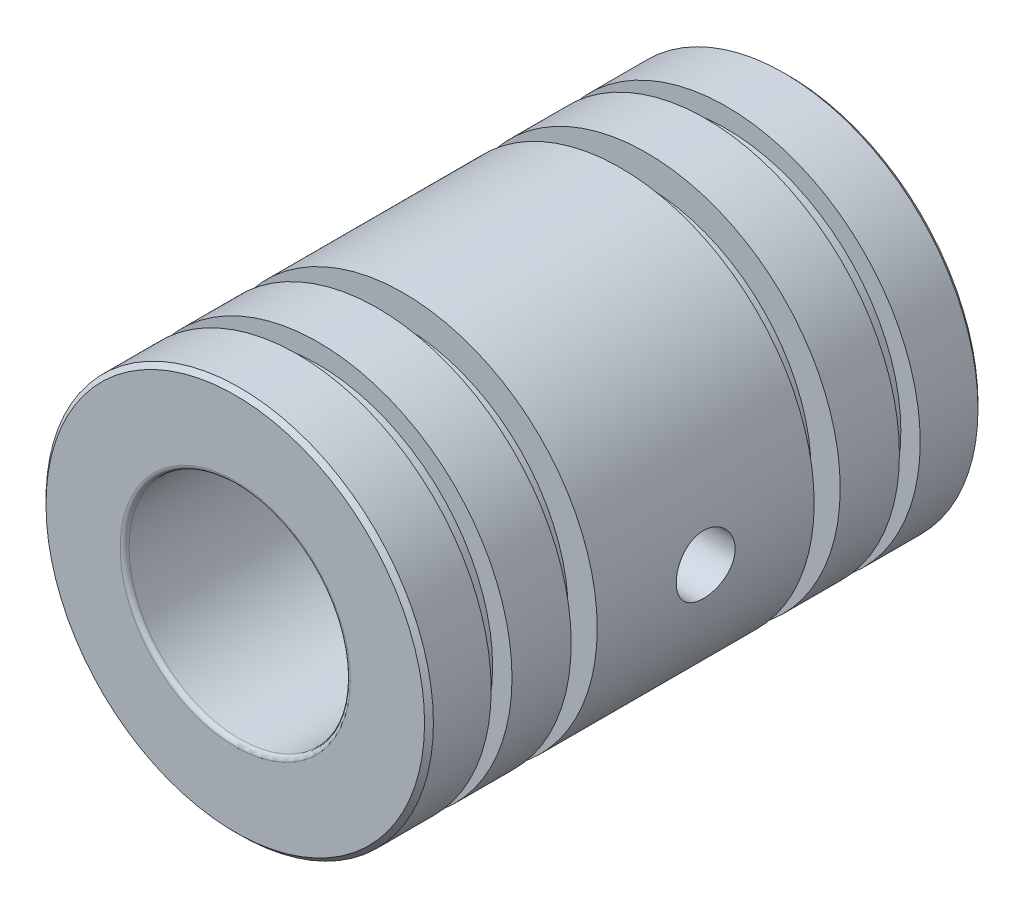
ISO-10303-21;
HEADER;
FILE_DESCRIPTION(('STEP AP214'),'2;1');
FILE_NAME('part.step','',(''),(''),'','','');
FILE_SCHEMA(('AUTOMOTIVE_DESIGN { 1 0 10303 214 1 1 1 1 }'));
ENDSEC;
DATA;
#1=APPLICATION_CONTEXT('core data for automotive mechanical design processes');
#2=APPLICATION_PROTOCOL_DEFINITION('international standard','automotive_design',2000,#1);
#3=PRODUCT_CONTEXT('',#1,'mechanical');
#4=PRODUCT('Part','Part','',(#3));
#5=PRODUCT_RELATED_PRODUCT_CATEGORY('part','',(#4));
#6=PRODUCT_DEFINITION_FORMATION('','',#4);
#7=PRODUCT_DEFINITION_CONTEXT('part definition',#1,'design');
#8=PRODUCT_DEFINITION('design','',#6,#7);
#9=PRODUCT_DEFINITION_SHAPE('','',#8);
#10=(LENGTH_UNIT() NAMED_UNIT(*) SI_UNIT(.MILLI.,.METRE.));
#11=(NAMED_UNIT(*) PLANE_ANGLE_UNIT() SI_UNIT($,.RADIAN.));
#12=(NAMED_UNIT(*) SI_UNIT($,.STERADIAN.) SOLID_ANGLE_UNIT());
#13=UNCERTAINTY_MEASURE_WITH_UNIT(LENGTH_MEASURE(1.E-05),#10,'distance_accuracy_value','');
#14=(GEOMETRIC_REPRESENTATION_CONTEXT(3) GLOBAL_UNCERTAINTY_ASSIGNED_CONTEXT((#13)) GLOBAL_UNIT_ASSIGNED_CONTEXT((#10,
#11,#12)) REPRESENTATION_CONTEXT('',''));
#15=CARTESIAN_POINT('',(0.,0.,0.));
#16=DIRECTION('',(0.,0.,1.));
#17=DIRECTION('',(1.,0.,0.));
#18=AXIS2_PLACEMENT_3D('',#15,#16,#17);
#19=CARTESIAN_POINT('',(0.,0.,15.875));
#20=DIRECTION('',(0.,0.,1.));
#21=DIRECTION('',(1.,0.,0.));
#22=AXIS2_PLACEMENT_3D('',#19,#20,#21);
#23=CYLINDRICAL_SURFACE('',#22,11.1125);
#24=CARTESIAN_POINT('',(0.,0.,-6.223));
#25=DIRECTION('',(0.,0.,1.));
#26=DIRECTION('',(1.,0.,0.));
#27=AXIS2_PLACEMENT_3D('',#24,#25,#26);
#28=CIRCLE('',#27,11.1125);
#29=CARTESIAN_POINT('',(11.1125,0.,-6.223));
#30=VERTEX_POINT('',#29);
#31=EDGE_CURVE('E172',#30,#30,#28,.T.);
#32=ORIENTED_EDGE('',*,*,#31,.T.);
#33=EDGE_LOOP('',(#32));
#34=FACE_BOUND('',#33,.T.);
#35=CARTESIAN_POINT('',(11.1125,0.,1.6891));
#36=CARTESIAN_POINT('',(11.1124984749764,0.0942947180013888,1.68909612294214));
#37=CARTESIAN_POINT('',(11.1112872289959,0.188643778422902,1.68117727792472));
#38=CARTESIAN_POINT('',(11.1065719094548,0.374703670779465,1.64971973587848));
#39=CARTESIAN_POINT('',(11.1030656176681,0.466411860620228,1.62616592690704));
#40=CARTESIAN_POINT('',(11.0941541485188,0.644470515147497,1.56415938509329));
#41=CARTESIAN_POINT('',(11.0887504202695,0.730825009517612,1.52571801990011));
#42=CARTESIAN_POINT('',(11.0766408487434,0.895844867603549,1.43505558685331));
#43=CARTESIAN_POINT('',(11.0699351826595,0.974511275474935,1.38283639380604));
#44=CARTESIAN_POINT('',(11.0559070755672,1.12256520688657,1.26565485848024));
#45=CARTESIAN_POINT('',(11.0485805591148,1.19188219867193,1.20060388076072));
#46=CARTESIAN_POINT('',(11.0341683126251,1.31866102464177,1.05979607587218));
#47=CARTESIAN_POINT('',(11.0270825966066,1.37612216959946,0.984038626725219));
#48=CARTESIAN_POINT('',(11.0139146832658,1.47783369468768,0.823493222296239));
#49=CARTESIAN_POINT('',(11.0078377528534,1.52201565855481,0.738661453255868));
#50=CARTESIAN_POINT('',(10.9974312075013,1.59547740381971,0.562673340789719));
#51=CARTESIAN_POINT('',(10.993101494747,1.62475801946609,0.471517351748714));
#52=CARTESIAN_POINT('',(10.986719733247,1.66736648294441,0.286210857830755));
#53=CARTESIAN_POINT('',(10.9846504358495,1.68081520210582,0.1920887504306));
#54=CARTESIAN_POINT('',(10.9829714532546,1.69175259706892,0.00290273679306399));
#55=CARTESIAN_POINT('',(10.9833616230911,1.68924221353165,-0.0921611136063572));
#56=CARTESIAN_POINT('',(10.98654172094,1.66843140473334,-0.279677221021018));
#57=CARTESIAN_POINT('',(10.9893111685702,1.65026573312238,-0.372144830610382));
#58=CARTESIAN_POINT('',(10.9969057739665,1.59887100914534,-0.552704167925289));
#59=CARTESIAN_POINT('',(11.0017309913134,1.56564152019467,-0.640795768741774));
#60=CARTESIAN_POINT('',(11.0129160199178,1.48492267839586,-0.810511730441491));
#61=CARTESIAN_POINT('',(11.0192819395245,1.43737637644152,-0.892108586616015));
#62=CARTESIAN_POINT('',(11.0328266982025,1.32941411704717,-1.04621687762105));
#63=CARTESIAN_POINT('',(11.0400055920221,1.26899729262311,-1.11872769987534));
#64=CARTESIAN_POINT('',(11.0544578494198,1.1362699453425,-1.25338647800789));
#65=CARTESIAN_POINT('',(11.0617314257575,1.06384359306262,-1.3154202998185));
#66=CARTESIAN_POINT('',(11.0754850309764,0.909547536696382,-1.42647004973782));
#67=CARTESIAN_POINT('',(11.0819650562117,0.827677789226627,-1.47548591803803));
#68=CARTESIAN_POINT('',(11.0934084709383,0.656719032111041,-1.55911476726288));
#69=CARTESIAN_POINT('',(11.0983709172205,0.567625576107807,-1.59371879572403));
#70=CARTESIAN_POINT('',(11.1062121923282,0.384799714158148,-1.64744169192));
#71=CARTESIAN_POINT('',(11.1090911658332,0.291067630808221,-1.66656163490471));
#72=CARTESIAN_POINT('',(11.112421917308,0.102610130028601,-1.6886215086741));
#73=CARTESIAN_POINT('',(11.112897228859,0.00790347744211958,-1.69171832437733));
#74=CARTESIAN_POINT('',(11.1114312077064,-0.180676576341288,-1.68206066902567));
#75=CARTESIAN_POINT('',(11.1094899518851,-0.274550003951263,-1.66930670225754));
#76=CARTESIAN_POINT('',(11.1034234746128,-0.458322602323618,-1.6284399818359));
#77=CARTESIAN_POINT('',(11.0993091450531,-0.548239192070575,-1.60040380351264));
#78=CARTESIAN_POINT('',(11.0893563085869,-0.722095562567064,-1.52984935737822));
#79=CARTESIAN_POINT('',(11.0835177188378,-0.806035055904753,-1.48733039372245));
#80=CARTESIAN_POINT('',(11.0707065865661,-0.966243395573769,-1.38865027731608));
#81=CARTESIAN_POINT('',(11.0637259145496,-1.04245038899353,-1.33238978055868));
#82=CARTESIAN_POINT('',(11.0494325133765,-1.18439701178817,-1.20796174900408));
#83=CARTESIAN_POINT('',(11.0421197643941,-1.25013601514223,-1.13979350259446));
#84=CARTESIAN_POINT('',(11.027911609323,-1.3698526481885,-0.992785986745421));
#85=CARTESIAN_POINT('',(11.0210203018191,-1.42372501407067,-0.913860538298523));
#86=CARTESIAN_POINT('',(11.0085083326755,-1.51744705688315,-0.747988458778747));
#87=CARTESIAN_POINT('',(11.0028876359869,-1.55729712062619,-0.661042049051912));
#88=CARTESIAN_POINT('',(10.9935830785829,-1.62168086975073,-0.48190777505487));
#89=CARTESIAN_POINT('',(10.9898922642499,-1.64626960444178,-0.389740073552651));
#90=CARTESIAN_POINT('',(10.9848469871641,-1.67960770135315,-0.202522863830925));
#91=CARTESIAN_POINT('',(10.9834923583473,-1.68835818941118,-0.107473560934064));
#92=CARTESIAN_POINT('',(10.9832791398472,-1.68974408363072,0.0817593406678498));
#93=CARTESIAN_POINT('',(10.9843949114726,-1.68254501939657,0.175941739865271));
#94=CARTESIAN_POINT('',(10.9889409995611,-1.65259125336064,0.361739654774807));
#95=CARTESIAN_POINT('',(10.9923713119127,-1.62983657919189,0.453355175046429));
#96=CARTESIAN_POINT('',(11.0011509180981,-1.5694766174462,0.631370741498581));
#97=CARTESIAN_POINT('',(11.0064986765956,-1.53188320910921,0.717774896039901));
#98=CARTESIAN_POINT('',(11.0185124399751,-1.44292944490171,0.883076412987434));
#99=CARTESIAN_POINT('',(11.0251784919029,-1.3915685976905,0.961973507340946));
#100=CARTESIAN_POINT('',(11.0391600468561,-1.2759377262068,1.1108617759138));
#101=CARTESIAN_POINT('',(11.0464813147751,-1.21154519534934,1.18075727796835));
#102=CARTESIAN_POINT('',(11.0609005014592,-1.07193772039806,1.30880915286964));
#103=CARTESIAN_POINT('',(11.0679983679652,-0.996720266689906,1.36696279598917));
#104=CARTESIAN_POINT('',(11.0812169924103,-0.837096535060927,1.47017510921196));
#105=CARTESIAN_POINT('',(11.0873319923142,-0.752640656325596,1.51515779596735));
#106=CARTESIAN_POINT('',(11.0978394926998,-0.577318458635133,1.59023171611085));
#107=CARTESIAN_POINT('',(11.1022337683781,-0.48645886095237,1.62033830496764));
#108=CARTESIAN_POINT('',(11.1078066875595,-0.329331519619616,1.65800913628462));
#109=CARTESIAN_POINT('',(11.1095575986727,-0.26403154459362,1.66965029472057));
#110=CARTESIAN_POINT('',(11.1119047832509,-0.132496649737016,1.68519703878132));
#111=CARTESIAN_POINT('',(11.1125010716477,-0.0662617420083522,1.68910272444325));
#112=CARTESIAN_POINT('',(11.1125,0.,1.6891));
#113=B_SPLINE_CURVE_WITH_KNOTS('',3,(#35,#36,#37,#38,#39,#40,#41,#42,#43,#44,#45,#46,#47,#48,
#49,#50,#51,#52,#53,#54,#55,#56,#57,#58,#59,#60,#61,#62,#63,#64,#65,#66,#67,#68,#69,#70,#71,#72,
#73,#74,#75,#76,#77,#78,#79,#80,#81,#82,#83,#84,#85,#86,#87,#88,#89,#90,#91,#92,#93,#94,#95,#96,
#97,#98,#99,#100,#101,#102,#103,#104,#105,#106,#107,#108,#109,#110,#111,#112),.UNSPECIFIED.,.T.,
.F.,(4,2,2,2,2,2,2,2,2,2,2,2,2,2,2,2,2,2,2,2,2,2,2,2,2,2,2,2,2,2,2,2,2,2,2,2,2,2,4),(0.,
0.28264201751582,0.565557620659231,0.848257623306881,1.1309191776106,1.41560627448944,
1.70030991668317,1.98645619418444,2.2725864500884,2.55651772854463,2.84043227168535,
3.12192714088812,3.40343016899077,3.68606808748625,3.96872505105919,4.25428632066245,
4.53984890219968,4.82558860818705,5.1113084700618,5.39422543767032,5.6771334046109,
5.95863665032551,6.24015342314451,6.52376900228936,6.80740153622974,7.09345689140637,
7.37950435497386,7.66451392392823,7.94950323261455,8.23154869897909,8.51359366431867,
8.79541329328923,9.07724298134879,9.36185661298471,9.64653633511838,9.93282740272132,
10.2188223331646,10.4174399763038,10.616055050852),.UNSPECIFIED.);
#114=CARTESIAN_POINT('',(11.1125,0.,1.6891));
#115=VERTEX_POINT('',#114);
#116=EDGE_CURVE('E93',#115,#115,#113,.T.);
#117=ORIENTED_EDGE('',*,*,#116,.T.);
#118=EDGE_LOOP('',(#117));
#119=FACE_BOUND('',#118,.T.);
#120=CARTESIAN_POINT('',(0.,0.,6.223));
#121=DIRECTION('',(0.,0.,1.));
#122=DIRECTION('',(1.,0.,0.));
#123=AXIS2_PLACEMENT_3D('',#120,#121,#122);
#124=CIRCLE('',#123,11.1125);
#125=CARTESIAN_POINT('',(11.1125,0.,6.223));
#126=VERTEX_POINT('',#125);
#127=EDGE_CURVE('E177',#126,#126,#124,.T.);
#128=ORIENTED_EDGE('',*,*,#127,.F.);
#129=EDGE_LOOP('',(#128));
#130=FACE_BOUND('',#129,.T.);
#131=ADVANCED_FACE('F41',(#34,#119,#130),#23,.T.);
#132=CARTESIAN_POINT('',(0.,0.,7.71525));
#133=DIRECTION('',(0.,0.,1.));
#134=DIRECTION('',(1.,0.,0.));
#135=AXIS2_PLACEMENT_3D('',#132,#133,#134);
#136=CIRCLE('',#135,11.1125);
#137=CARTESIAN_POINT('',(11.1125,0.,7.71525));
#138=VERTEX_POINT('',#137);
#139=EDGE_CURVE('E181',#138,#138,#136,.T.);
#140=ORIENTED_EDGE('',*,*,#139,.T.);
#141=EDGE_LOOP('',(#140));
#142=FACE_BOUND('',#141,.T.);
#143=CARTESIAN_POINT('',(0.,0.,11.1125));
#144=DIRECTION('',(0.,0.,1.));
#145=DIRECTION('',(1.,0.,0.));
#146=AXIS2_PLACEMENT_3D('',#143,#144,#145);
#147=CIRCLE('',#146,11.1125);
#148=CARTESIAN_POINT('',(11.1125,0.,11.1125));
#149=VERTEX_POINT('',#148);
#150=EDGE_CURVE('E217',#149,#149,#147,.T.);
#151=ORIENTED_EDGE('',*,*,#150,.F.);
#152=EDGE_LOOP('',(#151));
#153=FACE_BOUND('',#152,.T.);
#154=ADVANCED_FACE('F126',(#142,#153),#23,.T.);
#155=CARTESIAN_POINT('',(0.,0.,-7.71525));
#156=DIRECTION('',(0.,0.,1.));
#157=DIRECTION('',(1.,0.,0.));
#158=AXIS2_PLACEMENT_3D('',#155,#156,#157);
#159=CIRCLE('',#158,11.1125);
#160=CARTESIAN_POINT('',(11.1125,0.,-7.71525));
#161=VERTEX_POINT('',#160);
#162=EDGE_CURVE('E198',#161,#161,#159,.T.);
#163=ORIENTED_EDGE('',*,*,#162,.F.);
#164=EDGE_LOOP('',(#163));
#165=FACE_BOUND('',#164,.T.);
#166=CARTESIAN_POINT('',(0.,0.,-11.1125));
#167=DIRECTION('',(0.,0.,1.));
#168=DIRECTION('',(1.,0.,0.));
#169=AXIS2_PLACEMENT_3D('',#166,#167,#168);
#170=CIRCLE('',#169,11.1125);
#171=CARTESIAN_POINT('',(11.1125,0.,-11.1125));
#172=VERTEX_POINT('',#171);
#173=EDGE_CURVE('E214',#172,#172,#170,.T.);
#174=ORIENTED_EDGE('',*,*,#173,.T.);
#175=EDGE_LOOP('',(#174));
#176=FACE_BOUND('',#175,.T.);
#177=ADVANCED_FACE('F121',(#165,#176),#23,.T.);
#178=CARTESIAN_POINT('',(0.,0.,-15.875));
#179=DIRECTION('',(0.,0.,1.));
#180=DIRECTION('',(1.,0.,0.));
#181=AXIS2_PLACEMENT_3D('',#178,#179,#180);
#182=CYLINDRICAL_SURFACE('',#181,6.35);
#183=CARTESIAN_POINT('',(0.,0.,-15.621));
#184=DIRECTION('',(0.,0.,-1.));
#185=DIRECTION('',(-1.,0.,0.));
#186=AXIS2_PLACEMENT_3D('',#183,#184,#185);
#187=CIRCLE('',#186,6.35);
#188=CARTESIAN_POINT('',(-6.35,0.,-15.621));
#189=VERTEX_POINT('',#188);
#190=EDGE_CURVE('E71',#189,#189,#187,.T.);
#191=ORIENTED_EDGE('',*,*,#190,.T.);
#192=EDGE_LOOP('',(#191));
#193=FACE_BOUND('',#192,.T.);
#194=CARTESIAN_POINT('',(0.,0.,15.621));
#195=DIRECTION('',(0.,0.,1.));
#196=DIRECTION('',(1.,0.,0.));
#197=AXIS2_PLACEMENT_3D('',#194,#195,#196);
#198=CIRCLE('',#197,6.35);
#199=CARTESIAN_POINT('',(6.35,0.,15.621));
#200=VERTEX_POINT('',#199);
#201=EDGE_CURVE('E75',#200,#200,#198,.T.);
#202=ORIENTED_EDGE('',*,*,#201,.T.);
#203=EDGE_LOOP('',(#202));
#204=FACE_BOUND('',#203,.T.);
#205=CARTESIAN_POINT('',(6.35,0.,-1.6891));
#206=CARTESIAN_POINT('',(6.34999858799407,-0.0931240590204366,-1.68909777197306));
#207=CARTESIAN_POINT('',(6.34793130522448,-0.186272036662523,-1.6813729554857));
#208=CARTESIAN_POINT('',(6.3398852565763,-0.369885233127728,-1.65073213569451));
#209=CARTESIAN_POINT('',(6.33390459465551,-0.460349129285711,-1.62780876858261));
#210=CARTESIAN_POINT('',(6.31869198294802,-0.635917190571699,-1.5675684249665));
#211=CARTESIAN_POINT('',(6.30946421467283,-0.721028083738133,-1.53026995436715));
#212=CARTESIAN_POINT('',(6.28873291155952,-0.883786288792739,-1.44240662915023));
#213=CARTESIAN_POINT('',(6.27722922809338,-0.961433112749553,-1.39184090804806));
#214=CARTESIAN_POINT('',(6.25289150423184,-1.10885118261677,-1.27764627591049));
#215=CARTESIAN_POINT('',(6.24003481449505,-1.17842561113038,-1.21376810765468));
#216=CARTESIAN_POINT('',(6.2145857493007,-1.30601126990751,-1.07529471903621));
#217=CARTESIAN_POINT('',(6.20199340787494,-1.36402101942095,-1.00069812838025));
#218=CARTESIAN_POINT('',(6.17826723936177,-1.46778890318137,-0.841336155171863));
#219=CARTESIAN_POINT('',(6.16716199542921,-1.51332087034247,-0.756418858665133));
#220=CARTESIAN_POINT('',(6.14800029264132,-1.58938405110329,-0.57979123411104));
#221=CARTESIAN_POINT('',(6.1399432747989,-1.61991801536018,-0.488082155240309));
#222=CARTESIAN_POINT('',(6.12802406615999,-1.66443539995798,-0.302653327649747));
#223=CARTESIAN_POINT('',(6.12407162376813,-1.67877553924172,-0.209025161623556));
#224=CARTESIAN_POINT('',(6.12053941001427,-1.69161028881764,-0.0206150162311408));
#225=CARTESIAN_POINT('',(6.12095882602861,-1.69010784386578,0.0741667454379444));
#226=CARTESIAN_POINT('',(6.12604214898917,-1.67158333133872,0.259411331168465));
#227=CARTESIAN_POINT('',(6.13058807183681,-1.65499263874558,0.3499210450327));
#228=CARTESIAN_POINT('',(6.14322331926892,-1.60745336889665,0.52682366555587));
#229=CARTESIAN_POINT('',(6.15131292578796,-1.5765036492287,0.613216244050045));
#230=CARTESIAN_POINT('',(6.17022797969201,-1.50077269854157,0.780557986819868));
#231=CARTESIAN_POINT('',(6.18108313506484,-1.45584001864304,0.861435112751608));
#232=CARTESIAN_POINT('',(6.20429018122603,-1.35352428946652,1.01465321823913));
#233=CARTESIAN_POINT('',(6.21664236510196,-1.29613880043913,1.08699252077411));
#234=CARTESIAN_POINT('',(6.24194302869873,-1.1683395841275,1.22354644882543));
#235=CARTESIAN_POINT('',(6.25489785182337,-1.09756353951276,1.28742128533209));
#236=CARTESIAN_POINT('',(6.27958461479164,-0.946146149926555,1.40246457568491));
#237=CARTESIAN_POINT('',(6.29131650690537,-0.865504420173152,1.4536325337008));
#238=CARTESIAN_POINT('',(6.31230711266203,-0.696120281114941,1.54195817225399));
#239=CARTESIAN_POINT('',(6.32155496741236,-0.607344508940898,1.579054621508));
#240=CARTESIAN_POINT('',(6.3364570033994,-0.424514470723707,1.6376987554463));
#241=CARTESIAN_POINT('',(6.3421119658301,-0.330461356963699,1.65924982026433));
#242=CARTESIAN_POINT('',(6.34907302187173,-0.142646503375228,1.68565851448614));
#243=CARTESIAN_POINT('',(6.35049943992295,-0.0489540874528672,1.69097814641486));
#244=CARTESIAN_POINT('',(6.34918849562564,0.137984083368047,1.68604848957666));
#245=CARTESIAN_POINT('',(6.34645156133181,0.231229883196631,1.67580080136255));
#246=CARTESIAN_POINT('',(6.33719912887195,0.412980751596178,1.6404064203483));
#247=CARTESIAN_POINT('',(6.330748965139,0.501539588842749,1.615517184688));
#248=CARTESIAN_POINT('',(6.31480155408901,0.673216585164126,1.55184499419199));
#249=CARTESIAN_POINT('',(6.3053039774357,0.756334155027459,1.51306053763611));
#250=CARTESIAN_POINT('',(6.28403306970196,0.916566142458839,1.42184031842109));
#251=CARTESIAN_POINT('',(6.27221894339664,0.993531750096235,1.36915291534668));
#252=CARTESIAN_POINT('',(6.24768071632489,1.13769149379652,1.25193898040329));
#253=CARTESIAN_POINT('',(6.23495643704734,1.20488370509032,1.18741012212635));
#254=CARTESIAN_POINT('',(6.20958970437761,1.32953434639563,1.04618944981114));
#255=CARTESIAN_POINT('',(6.19695955694755,1.38666688954869,0.969207244369575));
#256=CARTESIAN_POINT('',(6.17360368077819,1.48720944474812,0.806481370033209));
#257=CARTESIAN_POINT('',(6.16287787228863,1.53062003150455,0.720738068274244));
#258=CARTESIAN_POINT('',(6.14466823613838,1.60215968135612,0.543353248443408));
#259=CARTESIAN_POINT('',(6.13716566603264,1.63037733801569,0.451749488231786));
#260=CARTESIAN_POINT('',(6.12624737948777,1.67094065852198,0.264863886156529));
#261=CARTESIAN_POINT('',(6.12283062501455,1.68329035381044,0.169582984852704));
#262=CARTESIAN_POINT('',(6.12055723036554,1.69153615993428,-0.0186166293977317));
#263=CARTESIAN_POINT('',(6.1215554498385,1.68795593627046,-0.111510989633879));
#264=CARTESIAN_POINT('',(6.12765988704943,1.66565758720449,-0.295320148803725));
#265=CARTESIAN_POINT('',(6.13276600007517,1.64693984766496,-0.386234998135457));
#266=CARTESIAN_POINT('',(6.1464247272742,1.59520068758993,-0.562849004131698));
#267=CARTESIAN_POINT('',(6.15495069602919,1.56228970640192,-0.648582719510706));
#268=CARTESIAN_POINT('',(6.17448923961762,1.48318412841704,-0.813376364200577));
#269=CARTESIAN_POINT('',(6.18550220265951,1.43698745747649,-0.892435248951112));
#270=CARTESIAN_POINT('',(6.20917679548953,1.33103250450581,-1.04413590869964));
#271=CARTESIAN_POINT('',(6.22187726759753,1.27091662506422,-1.11652189129528));
#272=CARTESIAN_POINT('',(6.2472783194816,1.13951050333036,-1.25034867964683));
#273=CARTESIAN_POINT('',(6.25997889853468,1.06821755066514,-1.31178682287649));
#274=CARTESIAN_POINT('',(6.28427189357105,0.914652692751312,-1.42325701184559));
#275=CARTESIAN_POINT('',(6.29583502092769,0.832179653596419,-1.4730188918447));
#276=CARTESIAN_POINT('',(6.3162303647196,0.6597341320436,-1.55789326624138));
#277=CARTESIAN_POINT('',(6.32506434094561,0.569766529957292,-1.59301520578019));
#278=CARTESIAN_POINT('',(6.33785694141243,0.400104929876594,-1.6430057369371));
#279=CARTESIAN_POINT('',(6.34237748259408,0.321145419475438,-1.66025105176472));
#280=CARTESIAN_POINT('',(6.34844947897127,0.161463150772511,-1.68329859018739));
#281=CARTESIAN_POINT('',(6.35000122423956,0.0807405655154411,-1.68910193174736));
#282=CARTESIAN_POINT('',(6.35,0.,-1.6891));
#283=B_SPLINE_CURVE_WITH_KNOTS('',3,(#205,#206,#207,#208,#209,#210,#211,#212,#213,#214,#215,
#216,#217,#218,#219,#220,#221,#222,#223,#224,#225,#226,#227,#228,#229,#230,#231,#232,#233,#234,
#235,#236,#237,#238,#239,#240,#241,#242,#243,#244,#245,#246,#247,#248,#249,#250,#251,#252,#253,
#254,#255,#256,#257,#258,#259,#260,#261,#262,#263,#264,#265,#266,#267,#268,#269,#270,#271,#272,
#273,#274,#275,#276,#277,#278,#279,#280,#281,#282),.UNSPECIFIED.,.T.,.F.,(4,2,2,2,2,2,2,2,2,2,2,
2,2,2,2,2,2,2,2,2,2,2,2,2,2,2,2,2,2,2,2,2,2,2,2,2,2,2,4),(0.,0.279076089260804,0.55828749181825,
0.837140643540613,1.11601201170744,1.40066914010057,1.68536269282731,1.97491854184098,
2.26442126601275,2.54741419375422,2.83035452083375,3.10545144163015,3.38057025304441,
3.65877915482343,3.93704261247002,4.2243350632149,4.51163872252829,4.80017860262934,
5.08865572470539,5.36884137771598,5.64899822541023,5.92437012972581,6.19977180372634,
6.48054806990967,6.76137955741592,7.05008810388805,7.33878455691738,7.62577880141424,
7.91270011722941,8.19026040126876,8.46781361038464,8.74324504451813,9.01871950199429,
9.30226286355041,9.58587508931907,9.87551494504198,10.1649676456666,10.4069562729505,
10.6489212549946),.UNSPECIFIED.);
#284=CARTESIAN_POINT('',(6.35,0.,-1.6891));
#285=VERTEX_POINT('',#284);
#286=EDGE_CURVE('E84',#285,#285,#283,.T.);
#287=ORIENTED_EDGE('',*,*,#286,.F.);
#288=EDGE_LOOP('',(#287));
#289=FACE_BOUND('',#288,.T.);
#290=ADVANCED_FACE('F96',(#193,#204,#289),#182,.F.);
#291=CARTESIAN_POINT('',(0.,0.,15.875));
#292=DIRECTION('',(0.,0.,1.));
#293=DIRECTION('',(1.,0.,0.));
#294=AXIS2_PLACEMENT_3D('',#291,#292,#293);
#295=PLANE('',#294);
#296=CARTESIAN_POINT('',(0.,0.,15.875));
#297=DIRECTION('',(0.,0.,1.));
#298=DIRECTION('',(1.,0.,0.));
#299=AXIS2_PLACEMENT_3D('',#296,#297,#298);
#300=CIRCLE('',#299,10.8585);
#301=CARTESIAN_POINT('',(10.8585,0.,15.875));
#302=VERTEX_POINT('',#301);
#303=EDGE_CURVE('E49',#302,#302,#300,.T.);
#304=ORIENTED_EDGE('',*,*,#303,.T.);
#305=EDGE_LOOP('',(#304));
#306=FACE_BOUND('',#305,.T.);
#307=CARTESIAN_POINT('',(0.,0.,15.875));
#308=DIRECTION('',(0.,0.,1.));
#309=DIRECTION('',(1.,0.,0.));
#310=AXIS2_PLACEMENT_3D('',#307,#308,#309);
#311=CIRCLE('',#310,6.604);
#312=CARTESIAN_POINT('',(6.604,0.,15.875));
#313=VERTEX_POINT('',#312);
#314=EDGE_CURVE('E67',#313,#313,#311,.F.);
#315=ORIENTED_EDGE('',*,*,#314,.T.);
#316=EDGE_LOOP('',(#315));
#317=FACE_BOUND('',#316,.T.);
#318=ADVANCED_FACE('F145',(#306,#317),#295,.T.);
#319=CARTESIAN_POINT('',(0.,0.,15.875));
#320=DIRECTION('',(0.,0.,1.));
#321=DIRECTION('',(1.,0.,0.));
#322=AXIS2_PLACEMENT_3D('',#319,#320,#321);
#323=CYLINDRICAL_SURFACE('',#322,11.1125);
#324=CARTESIAN_POINT('',(0.,0.,15.621));
#325=DIRECTION('',(0.,0.,1.));
#326=DIRECTION('',(1.,0.,0.));
#327=AXIS2_PLACEMENT_3D('',#324,#325,#326);
#328=CIRCLE('',#327,11.1125);
#329=CARTESIAN_POINT('',(11.1125,0.,15.621));
#330=VERTEX_POINT('',#329);
#331=EDGE_CURVE('E10',#330,#330,#328,.F.);
#332=ORIENTED_EDGE('',*,*,#331,.T.);
#333=EDGE_LOOP('',(#332));
#334=FACE_BOUND('',#333,.T.);
#335=CARTESIAN_POINT('',(0.,0.,12.3063));
#336=DIRECTION('',(0.,0.,1.));
#337=DIRECTION('',(1.,0.,0.));
#338=AXIS2_PLACEMENT_3D('',#335,#336,#337);
#339=CIRCLE('',#338,11.1125);
#340=CARTESIAN_POINT('',(11.1125,0.,12.3063));
#341=VERTEX_POINT('',#340);
#342=EDGE_CURVE('E83',#341,#341,#339,.T.);
#343=ORIENTED_EDGE('',*,*,#342,.T.);
#344=EDGE_LOOP('',(#343));
#345=FACE_BOUND('',#344,.T.);
#346=ADVANCED_FACE('F141',(#334,#345),#323,.T.);
#347=CARTESIAN_POINT('',(0.,11.1125,12.3063));
#348=DIRECTION('',(0.,0.,-1.));
#349=DIRECTION('',(-1.,0.,0.));
#350=AXIS2_PLACEMENT_3D('',#347,#348,#349);
#351=PLANE('',#350);
#352=CARTESIAN_POINT('',(0.,0.,12.3063));
#353=DIRECTION('',(0.,0.,1.));
#354=DIRECTION('',(1.,0.,0.));
#355=AXIS2_PLACEMENT_3D('',#352,#353,#354);
#356=CIRCLE('',#355,10.00125);
#357=CARTESIAN_POINT('',(10.00125,0.,12.3063));
#358=VERTEX_POINT('',#357);
#359=EDGE_CURVE('E232',#358,#358,#356,.T.);
#360=ORIENTED_EDGE('',*,*,#359,.T.);
#361=EDGE_LOOP('',(#360));
#362=FACE_BOUND('',#361,.T.);
#363=ORIENTED_EDGE('',*,*,#342,.F.);
#364=EDGE_LOOP('',(#363));
#365=FACE_BOUND('',#364,.T.);
#366=ADVANCED_FACE('F137',(#362,#365),#351,.T.);
#367=CARTESIAN_POINT('',(0.,0.,15.875));
#368=DIRECTION('',(0.,0.,1.));
#369=DIRECTION('',(1.,0.,0.));
#370=AXIS2_PLACEMENT_3D('',#367,#368,#369);
#371=CYLINDRICAL_SURFACE('',#370,10.00125);
#372=CARTESIAN_POINT('',(0.,0.,11.1125));
#373=DIRECTION('',(0.,0.,1.));
#374=DIRECTION('',(1.,0.,0.));
#375=AXIS2_PLACEMENT_3D('',#372,#373,#374);
#376=CIRCLE('',#375,10.00125);
#377=CARTESIAN_POINT('',(10.00125,0.,11.1125));
#378=VERTEX_POINT('',#377);
#379=EDGE_CURVE('E224',#378,#378,#376,.T.);
#380=ORIENTED_EDGE('',*,*,#379,.T.);
#381=EDGE_LOOP('',(#380));
#382=FACE_BOUND('',#381,.T.);
#383=ORIENTED_EDGE('',*,*,#359,.F.);
#384=EDGE_LOOP('',(#383));
#385=FACE_BOUND('',#384,.T.);
#386=ADVANCED_FACE('F133',(#382,#385),#371,.T.);
#387=CARTESIAN_POINT('',(0.,10.00125,11.1125));
#388=DIRECTION('',(0.,0.,1.));
#389=DIRECTION('',(1.,0.,0.));
#390=AXIS2_PLACEMENT_3D('',#387,#388,#389);
#391=PLANE('',#390);
#392=ORIENTED_EDGE('',*,*,#150,.T.);
#393=EDGE_LOOP('',(#392));
#394=FACE_BOUND('',#393,.T.);
#395=ORIENTED_EDGE('',*,*,#379,.F.);
#396=EDGE_LOOP('',(#395));
#397=FACE_BOUND('',#396,.T.);
#398=ADVANCED_FACE('F130',(#394,#397),#391,.T.);
#399=CARTESIAN_POINT('',(0.,10.00125,-11.1125));
#400=DIRECTION('',(0.,0.,-1.));
#401=DIRECTION('',(-1.,0.,0.));
#402=AXIS2_PLACEMENT_3D('',#399,#400,#401);
#403=PLANE('',#402);
#404=CARTESIAN_POINT('',(0.,0.,-11.1125));
#405=DIRECTION('',(0.,0.,1.));
#406=DIRECTION('',(1.,0.,0.));
#407=AXIS2_PLACEMENT_3D('',#404,#405,#406);
#408=CIRCLE('',#407,10.00125);
#409=CARTESIAN_POINT('',(10.00125,0.,-11.1125));
#410=VERTEX_POINT('',#409);
#411=EDGE_CURVE('E218',#410,#410,#408,.T.);
#412=ORIENTED_EDGE('',*,*,#411,.T.);
#413=EDGE_LOOP('',(#412));
#414=FACE_BOUND('',#413,.T.);
#415=ORIENTED_EDGE('',*,*,#173,.F.);
#416=EDGE_LOOP('',(#415));
#417=FACE_BOUND('',#416,.T.);
#418=ADVANCED_FACE('F128',(#414,#417),#403,.T.);
#419=CARTESIAN_POINT('',(0.,0.,15.875));
#420=DIRECTION('',(0.,0.,1.));
#421=DIRECTION('',(1.,0.,0.));
#422=AXIS2_PLACEMENT_3D('',#419,#420,#421);
#423=CYLINDRICAL_SURFACE('',#422,10.00125);
#424=CARTESIAN_POINT('',(0.,0.,-12.3063));
#425=DIRECTION('',(0.,0.,1.));
#426=DIRECTION('',(1.,0.,0.));
#427=AXIS2_PLACEMENT_3D('',#424,#425,#426);
#428=CIRCLE('',#427,10.00125);
#429=CARTESIAN_POINT('',(10.00125,0.,-12.3063));
#430=VERTEX_POINT('',#429);
#431=EDGE_CURVE('E227',#430,#430,#428,.T.);
#432=ORIENTED_EDGE('',*,*,#431,.T.);
#433=EDGE_LOOP('',(#432));
#434=FACE_BOUND('',#433,.T.);
#435=ORIENTED_EDGE('',*,*,#411,.F.);
#436=EDGE_LOOP('',(#435));
#437=FACE_BOUND('',#436,.T.);
#438=ADVANCED_FACE('F276',(#434,#437),#423,.T.);
#439=CARTESIAN_POINT('',(0.,11.1125,-12.3063));
#440=DIRECTION('',(0.,0.,1.));
#441=DIRECTION('',(1.,0.,0.));
#442=AXIS2_PLACEMENT_3D('',#439,#440,#441);
#443=PLANE('',#442);
#444=CARTESIAN_POINT('',(0.,0.,-12.3063));
#445=DIRECTION('',(0.,0.,1.));
#446=DIRECTION('',(1.,0.,0.));
#447=AXIS2_PLACEMENT_3D('',#444,#445,#446);
#448=CIRCLE('',#447,11.1125);
#449=CARTESIAN_POINT('',(11.1125,0.,-12.3063));
#450=VERTEX_POINT('',#449);
#451=EDGE_CURVE('E118',#450,#450,#448,.T.);
#452=ORIENTED_EDGE('',*,*,#451,.T.);
#453=EDGE_LOOP('',(#452));
#454=FACE_BOUND('',#453,.T.);
#455=ORIENTED_EDGE('',*,*,#431,.F.);
#456=EDGE_LOOP('',(#455));
#457=FACE_BOUND('',#456,.T.);
#458=ADVANCED_FACE('F264',(#454,#457),#443,.T.);
#459=CARTESIAN_POINT('',(0.,0.,15.875));
#460=DIRECTION('',(0.,0.,1.));
#461=DIRECTION('',(1.,0.,0.));
#462=AXIS2_PLACEMENT_3D('',#459,#460,#461);
#463=CYLINDRICAL_SURFACE('',#462,11.1125);
#464=CARTESIAN_POINT('',(0.,0.,-15.621));
#465=DIRECTION('',(0.,0.,-1.));
#466=DIRECTION('',(-1.,0.,0.));
#467=AXIS2_PLACEMENT_3D('',#464,#465,#466);
#468=CIRCLE('',#467,11.1125);
#469=CARTESIAN_POINT('',(-11.1125,0.,-15.621));
#470=VERTEX_POINT('',#469);
#471=EDGE_CURVE('E61',#470,#470,#468,.F.);
#472=ORIENTED_EDGE('',*,*,#471,.T.);
#473=EDGE_LOOP('',(#472));
#474=FACE_BOUND('',#473,.T.);
#475=ORIENTED_EDGE('',*,*,#451,.F.);
#476=EDGE_LOOP('',(#475));
#477=FACE_BOUND('',#476,.T.);
#478=ADVANCED_FACE('F267',(#474,#477),#463,.T.);
#479=CARTESIAN_POINT('',(0.,0.,-15.875));
#480=DIRECTION('',(0.,0.,-1.));
#481=DIRECTION('',(-1.,0.,0.));
#482=AXIS2_PLACEMENT_3D('',#479,#480,#481);
#483=PLANE('',#482);
#484=CARTESIAN_POINT('',(0.,0.,-15.875));
#485=DIRECTION('',(0.,0.,-1.));
#486=DIRECTION('',(-1.,0.,0.));
#487=AXIS2_PLACEMENT_3D('',#484,#485,#486);
#488=CIRCLE('',#487,10.8585);
#489=CARTESIAN_POINT('',(-10.8585,0.,-15.875));
#490=VERTEX_POINT('',#489);
#491=EDGE_CURVE('E55',#490,#490,#488,.T.);
#492=ORIENTED_EDGE('',*,*,#491,.T.);
#493=EDGE_LOOP('',(#492));
#494=FACE_BOUND('',#493,.T.);
#495=CARTESIAN_POINT('',(0.,0.,-15.875));
#496=DIRECTION('',(0.,0.,-1.));
#497=DIRECTION('',(-1.,0.,0.));
#498=AXIS2_PLACEMENT_3D('',#495,#496,#497);
#499=CIRCLE('',#498,6.604);
#500=CARTESIAN_POINT('',(-6.604,0.,-15.875));
#501=VERTEX_POINT('',#500);
#502=EDGE_CURVE('E79',#501,#501,#499,.F.);
#503=ORIENTED_EDGE('',*,*,#502,.T.);
#504=EDGE_LOOP('',(#503));
#505=FACE_BOUND('',#504,.T.);
#506=ADVANCED_FACE('F104',(#494,#505),#483,.T.);
#507=CARTESIAN_POINT('',(11.1125,0.,0.));
#508=DIRECTION('',(-1.,0.,0.));
#509=DIRECTION('',(0.,0.,1.));
#510=AXIS2_PLACEMENT_3D('',#507,#508,#509);
#511=CYLINDRICAL_SURFACE('',#510,1.6891);
#512=ORIENTED_EDGE('',*,*,#116,.F.);
#513=EDGE_LOOP('',(#512));
#514=FACE_BOUND('',#513,.T.);
#515=ORIENTED_EDGE('',*,*,#286,.T.);
#516=EDGE_LOOP('',(#515));
#517=FACE_BOUND('',#516,.T.);
#518=ADVANCED_FACE('F99',(#514,#517),#511,.F.);
#519=CARTESIAN_POINT('',(0.,0.,-15.621));
#520=DIRECTION('',(0.,0.,-1.));
#521=DIRECTION('',(-1.,0.,0.));
#522=AXIS2_PLACEMENT_3D('',#519,#520,#521);
#523=TOROIDAL_SURFACE('',#522,6.604,0.254);
#524=ORIENTED_EDGE('',*,*,#190,.F.);
#525=EDGE_LOOP('',(#524));
#526=FACE_BOUND('',#525,.T.);
#527=ORIENTED_EDGE('',*,*,#502,.F.);
#528=EDGE_LOOP('',(#527));
#529=FACE_BOUND('',#528,.T.);
#530=ADVANCED_FACE('F103',(#526,#529),#523,.T.);
#531=CARTESIAN_POINT('',(0.,0.,15.621));
#532=DIRECTION('',(0.,0.,1.));
#533=DIRECTION('',(1.,0.,0.));
#534=AXIS2_PLACEMENT_3D('',#531,#532,#533);
#535=TOROIDAL_SURFACE('',#534,6.604,0.254);
#536=ORIENTED_EDGE('',*,*,#314,.F.);
#537=EDGE_LOOP('',(#536));
#538=FACE_BOUND('',#537,.T.);
#539=ORIENTED_EDGE('',*,*,#201,.F.);
#540=EDGE_LOOP('',(#539));
#541=FACE_BOUND('',#540,.T.);
#542=ADVANCED_FACE('F150',(#538,#541),#535,.T.);
#543=CARTESIAN_POINT('',(0.,0.,-15.621));
#544=DIRECTION('',(0.,0.,1.));
#545=DIRECTION('',(1.,0.,0.));
#546=AXIS2_PLACEMENT_3D('',#543,#544,#545);
#547=CONICAL_SURFACE('',#546,11.1125,0.785398163397438);
#548=ORIENTED_EDGE('',*,*,#491,.F.);
#549=EDGE_LOOP('',(#548));
#550=FACE_BOUND('',#549,.T.);
#551=ORIENTED_EDGE('',*,*,#471,.F.);
#552=EDGE_LOOP('',(#551));
#553=FACE_BOUND('',#552,.T.);
#554=ADVANCED_FACE('F153',(#550,#553),#547,.T.);
#555=CARTESIAN_POINT('',(0.,0.,15.875));
#556=DIRECTION('',(0.,0.,-1.));
#557=DIRECTION('',(-1.,0.,0.));
#558=AXIS2_PLACEMENT_3D('',#555,#556,#557);
#559=CONICAL_SURFACE('',#558,10.8585,0.785398163397445);
#560=ORIENTED_EDGE('',*,*,#331,.F.);
#561=EDGE_LOOP('',(#560));
#562=FACE_BOUND('',#561,.T.);
#563=ORIENTED_EDGE('',*,*,#303,.F.);
#564=EDGE_LOOP('',(#563));
#565=FACE_BOUND('',#564,.T.);
#566=ADVANCED_FACE('F43',(#562,#565),#559,.T.);
#567=CARTESIAN_POINT('',(0.,11.1125,7.71525));
#568=DIRECTION('',(0.,0.,1.));
#569=DIRECTION('',(1.,0.,0.));
#570=AXIS2_PLACEMENT_3D('',#567,#568,#569);
#571=PLANE('',#570);
#572=ORIENTED_EDGE('',*,*,#139,.F.);
#573=EDGE_LOOP('',(#572));
#574=FACE_BOUND('',#573,.T.);
#575=CARTESIAN_POINT('',(0.,0.,7.71525));
#576=DIRECTION('',(0.,0.,1.));
#577=DIRECTION('',(1.,0.,0.));
#578=AXIS2_PLACEMENT_3D('',#575,#576,#577);
#579=CIRCLE('',#578,9.44562500000001);
#580=CARTESIAN_POINT('',(9.44562500000001,0.,7.71525));
#581=VERTEX_POINT('',#580);
#582=EDGE_CURVE('E94',#581,#581,#579,.T.);
#583=ORIENTED_EDGE('',*,*,#582,.T.);
#584=EDGE_LOOP('',(#583));
#585=FACE_BOUND('',#584,.T.);
#586=ADVANCED_FACE('F106',(#574,#585),#571,.F.);
#587=CARTESIAN_POINT('',(0.,0.,15.875));
#588=DIRECTION('',(0.,0.,1.));
#589=DIRECTION('',(1.,0.,0.));
#590=AXIS2_PLACEMENT_3D('',#587,#588,#589);
#591=CYLINDRICAL_SURFACE('',#590,9.44562500000001);
#592=ORIENTED_EDGE('',*,*,#582,.F.);
#593=EDGE_LOOP('',(#592));
#594=FACE_BOUND('',#593,.T.);
#595=CARTESIAN_POINT('',(0.,0.,6.223));
#596=DIRECTION('',(0.,0.,1.));
#597=DIRECTION('',(1.,0.,0.));
#598=AXIS2_PLACEMENT_3D('',#595,#596,#597);
#599=CIRCLE('',#598,9.44562500000001);
#600=CARTESIAN_POINT('',(9.44562500000001,0.,6.223));
#601=VERTEX_POINT('',#600);
#602=EDGE_CURVE('E180',#601,#601,#599,.T.);
#603=ORIENTED_EDGE('',*,*,#602,.T.);
#604=EDGE_LOOP('',(#603));
#605=FACE_BOUND('',#604,.T.);
#606=ADVANCED_FACE('F398',(#594,#605),#591,.T.);
#607=CARTESIAN_POINT('',(0.,11.1125,6.223));
#608=DIRECTION('',(0.,0.,-1.));
#609=DIRECTION('',(-1.,0.,0.));
#610=AXIS2_PLACEMENT_3D('',#607,#608,#609);
#611=PLANE('',#610);
#612=ORIENTED_EDGE('',*,*,#602,.F.);
#613=EDGE_LOOP('',(#612));
#614=FACE_BOUND('',#613,.T.);
#615=ORIENTED_EDGE('',*,*,#127,.T.);
#616=EDGE_LOOP('',(#615));
#617=FACE_BOUND('',#616,.T.);
#618=ADVANCED_FACE('F404',(#614,#617),#611,.F.);
#619=CARTESIAN_POINT('',(0.,11.1125,-6.223));
#620=DIRECTION('',(0.,0.,1.));
#621=DIRECTION('',(1.,0.,0.));
#622=AXIS2_PLACEMENT_3D('',#619,#620,#621);
#623=PLANE('',#622);
#624=ORIENTED_EDGE('',*,*,#31,.F.);
#625=EDGE_LOOP('',(#624));
#626=FACE_BOUND('',#625,.T.);
#627=CARTESIAN_POINT('',(0.,0.,-6.223));
#628=DIRECTION('',(0.,0.,1.));
#629=DIRECTION('',(1.,0.,0.));
#630=AXIS2_PLACEMENT_3D('',#627,#628,#629);
#631=CIRCLE('',#630,9.44562500000001);
#632=CARTESIAN_POINT('',(9.44562500000001,0.,-6.223));
#633=VERTEX_POINT('',#632);
#634=EDGE_CURVE('E188',#633,#633,#631,.T.);
#635=ORIENTED_EDGE('',*,*,#634,.T.);
#636=EDGE_LOOP('',(#635));
#637=FACE_BOUND('',#636,.T.);
#638=ADVANCED_FACE('F411',(#626,#637),#623,.F.);
#639=CARTESIAN_POINT('',(0.,0.,15.875));
#640=DIRECTION('',(0.,0.,1.));
#641=DIRECTION('',(1.,0.,0.));
#642=AXIS2_PLACEMENT_3D('',#639,#640,#641);
#643=CYLINDRICAL_SURFACE('',#642,9.44562500000001);
#644=ORIENTED_EDGE('',*,*,#634,.F.);
#645=EDGE_LOOP('',(#644));
#646=FACE_BOUND('',#645,.T.);
#647=CARTESIAN_POINT('',(0.,0.,-7.71525));
#648=DIRECTION('',(0.,0.,1.));
#649=DIRECTION('',(1.,0.,0.));
#650=AXIS2_PLACEMENT_3D('',#647,#648,#649);
#651=CIRCLE('',#650,9.44562500000001);
#652=CARTESIAN_POINT('',(9.44562500000001,0.,-7.71525));
#653=VERTEX_POINT('',#652);
#654=EDGE_CURVE('E194',#653,#653,#651,.T.);
#655=ORIENTED_EDGE('',*,*,#654,.T.);
#656=EDGE_LOOP('',(#655));
#657=FACE_BOUND('',#656,.T.);
#658=ADVANCED_FACE('F419',(#646,#657),#643,.T.);
#659=CARTESIAN_POINT('',(0.,11.1125,-7.71525));
#660=DIRECTION('',(0.,0.,-1.));
#661=DIRECTION('',(-1.,0.,0.));
#662=AXIS2_PLACEMENT_3D('',#659,#660,#661);
#663=PLANE('',#662);
#664=ORIENTED_EDGE('',*,*,#654,.F.);
#665=EDGE_LOOP('',(#664));
#666=FACE_BOUND('',#665,.T.);
#667=ORIENTED_EDGE('',*,*,#162,.T.);
#668=EDGE_LOOP('',(#667));
#669=FACE_BOUND('',#668,.T.);
#670=ADVANCED_FACE('F210',(#666,#669),#663,.F.);
#671=CLOSED_SHELL('',(#131,#154,#177,#290,#318,#346,#366,#386,#398,#418,#438,#458,#478,#506,
#518,#530,#542,#554,#566,#586,#606,#618,#638,#658,#670));
#672=MANIFOLD_SOLID_BREP('B2',#671);
#673=ADVANCED_BREP_SHAPE_REPRESENTATION('',(#18,#672),#14);
#674=SHAPE_DEFINITION_REPRESENTATION(#9,#673);
ENDSEC;
END-ISO-10303-21;
